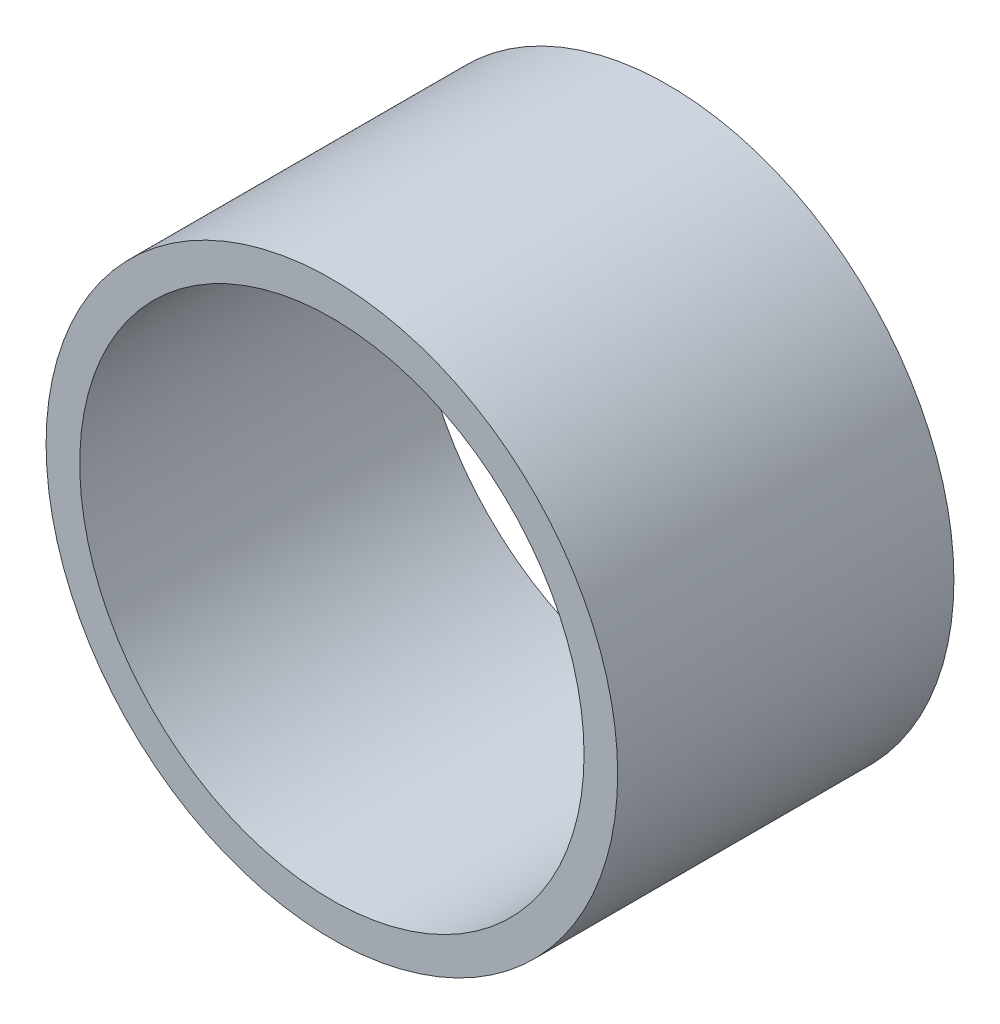
ISO-10303-21;
HEADER;
FILE_DESCRIPTION(('STEP AP214'),'2;1');
FILE_NAME('part.step','',(''),(''),'','','');
FILE_SCHEMA(('AUTOMOTIVE_DESIGN { 1 0 10303 214 1 1 1 1 }'));
ENDSEC;
DATA;
#1=APPLICATION_CONTEXT('core data for automotive mechanical design processes');
#2=APPLICATION_PROTOCOL_DEFINITION('international standard','automotive_design',2000,#1);
#3=PRODUCT_CONTEXT('',#1,'mechanical');
#4=PRODUCT('Part','Part','',(#3));
#5=PRODUCT_RELATED_PRODUCT_CATEGORY('part','',(#4));
#6=PRODUCT_DEFINITION_FORMATION('','',#4);
#7=PRODUCT_DEFINITION_CONTEXT('part definition',#1,'design');
#8=PRODUCT_DEFINITION('design','',#6,#7);
#9=PRODUCT_DEFINITION_SHAPE('','',#8);
#10=(LENGTH_UNIT() NAMED_UNIT(*) SI_UNIT(.MILLI.,.METRE.));
#11=(NAMED_UNIT(*) PLANE_ANGLE_UNIT() SI_UNIT($,.RADIAN.));
#12=(NAMED_UNIT(*) SI_UNIT($,.STERADIAN.) SOLID_ANGLE_UNIT());
#13=UNCERTAINTY_MEASURE_WITH_UNIT(LENGTH_MEASURE(1.E-05),#10,'distance_accuracy_value','');
#14=(GEOMETRIC_REPRESENTATION_CONTEXT(3) GLOBAL_UNCERTAINTY_ASSIGNED_CONTEXT((#13)) GLOBAL_UNIT_ASSIGNED_CONTEXT((#10,
#11,#12)) REPRESENTATION_CONTEXT('',''));
#15=CARTESIAN_POINT('',(0.,0.,0.));
#16=DIRECTION('',(0.,0.,1.));
#17=DIRECTION('',(1.,0.,0.));
#18=AXIS2_PLACEMENT_3D('',#15,#16,#17);
#19=CARTESIAN_POINT('',(0.,0.,10.));
#20=DIRECTION('',(0.,0.,1.));
#21=DIRECTION('',(1.,0.,0.));
#22=AXIS2_PLACEMENT_3D('',#19,#20,#21);
#23=PLANE('',#22);
#24=CARTESIAN_POINT('',(0.,0.,10.));
#25=DIRECTION('',(0.,0.,1.));
#26=DIRECTION('',(1.,0.,0.));
#27=AXIS2_PLACEMENT_3D('',#24,#25,#26);
#28=CIRCLE('',#27,8.5);
#29=CARTESIAN_POINT('',(8.5,0.,10.));
#30=VERTEX_POINT('',#29);
#31=EDGE_CURVE('E10',#30,#30,#28,.T.);
#32=ORIENTED_EDGE('',*,*,#31,.T.);
#33=EDGE_LOOP('',(#32));
#34=FACE_BOUND('',#33,.T.);
#35=CARTESIAN_POINT('',(0.,0.,10.));
#36=DIRECTION('',(0.,0.,1.));
#37=DIRECTION('',(1.,0.,0.));
#38=AXIS2_PLACEMENT_3D('',#35,#36,#37);
#39=CIRCLE('',#38,7.5);
#40=CARTESIAN_POINT('',(7.5,0.,10.));
#41=VERTEX_POINT('',#40);
#42=EDGE_CURVE('E48',#41,#41,#39,.T.);
#43=ORIENTED_EDGE('',*,*,#42,.F.);
#44=EDGE_LOOP('',(#43));
#45=FACE_BOUND('',#44,.T.);
#46=ADVANCED_FACE('F37',(#34,#45),#23,.T.);
#47=CARTESIAN_POINT('',(0.,0.,0.));
#48=DIRECTION('',(0.,0.,1.));
#49=DIRECTION('',(1.,0.,0.));
#50=AXIS2_PLACEMENT_3D('',#47,#48,#49);
#51=PLANE('',#50);
#52=CARTESIAN_POINT('',(0.,0.,0.));
#53=DIRECTION('',(0.,0.,1.));
#54=DIRECTION('',(1.,0.,0.));
#55=AXIS2_PLACEMENT_3D('',#52,#53,#54);
#56=CIRCLE('',#55,8.5);
#57=CARTESIAN_POINT('',(8.5,0.,0.));
#58=VERTEX_POINT('',#57);
#59=EDGE_CURVE('E41',#58,#58,#56,.T.);
#60=ORIENTED_EDGE('',*,*,#59,.F.);
#61=EDGE_LOOP('',(#60));
#62=FACE_BOUND('',#61,.T.);
#63=CARTESIAN_POINT('',(0.,0.,0.));
#64=DIRECTION('',(0.,0.,1.));
#65=DIRECTION('',(1.,0.,0.));
#66=AXIS2_PLACEMENT_3D('',#63,#64,#65);
#67=CIRCLE('',#66,7.5);
#68=CARTESIAN_POINT('',(7.5,0.,0.));
#69=VERTEX_POINT('',#68);
#70=EDGE_CURVE('E50',#69,#69,#67,.T.);
#71=ORIENTED_EDGE('',*,*,#70,.T.);
#72=EDGE_LOOP('',(#71));
#73=FACE_BOUND('',#72,.T.);
#74=ADVANCED_FACE('F60',(#62,#73),#51,.F.);
#75=CARTESIAN_POINT('',(0.,0.,10.));
#76=DIRECTION('',(0.,0.,-1.));
#77=DIRECTION('',(-1.,0.,0.));
#78=AXIS2_PLACEMENT_3D('',#75,#76,#77);
#79=CYLINDRICAL_SURFACE('',#78,8.5);
#80=ORIENTED_EDGE('',*,*,#31,.F.);
#81=EDGE_LOOP('',(#80));
#82=FACE_BOUND('',#81,.T.);
#83=ORIENTED_EDGE('',*,*,#59,.T.);
#84=EDGE_LOOP('',(#83));
#85=FACE_BOUND('',#84,.T.);
#86=ADVANCED_FACE('F39',(#82,#85),#79,.T.);
#87=CARTESIAN_POINT('',(0.,0.,10.));
#88=DIRECTION('',(0.,0.,-1.));
#89=DIRECTION('',(-1.,0.,0.));
#90=AXIS2_PLACEMENT_3D('',#87,#88,#89);
#91=CYLINDRICAL_SURFACE('',#90,7.5);
#92=ORIENTED_EDGE('',*,*,#42,.T.);
#93=EDGE_LOOP('',(#92));
#94=FACE_BOUND('',#93,.T.);
#95=ORIENTED_EDGE('',*,*,#70,.F.);
#96=EDGE_LOOP('',(#95));
#97=FACE_BOUND('',#96,.T.);
#98=ADVANCED_FACE('F56',(#94,#97),#91,.F.);
#99=CLOSED_SHELL('',(#46,#74,#86,#98));
#100=MANIFOLD_SOLID_BREP('B2',#99);
#101=ADVANCED_BREP_SHAPE_REPRESENTATION('',(#18,#100),#14);
#102=SHAPE_DEFINITION_REPRESENTATION(#9,#101);
ENDSEC;
END-ISO-10303-21;
